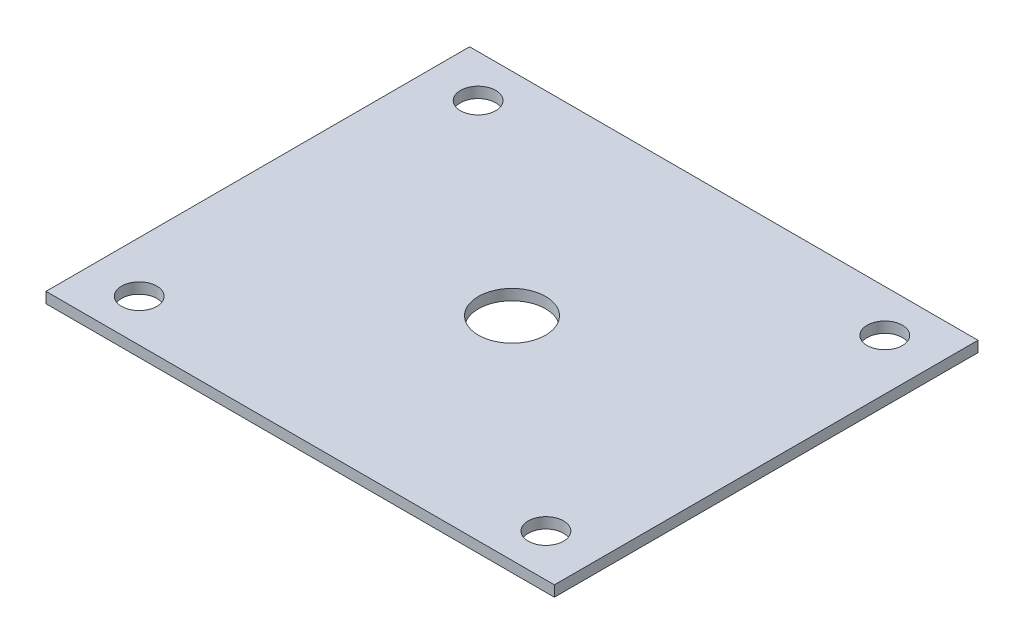
ISO-10303-21;
HEADER;
FILE_DESCRIPTION(('STEP AP214'),'2;1');
FILE_NAME('part.step','',(''),(''),'','','');
FILE_SCHEMA(('AUTOMOTIVE_DESIGN { 1 0 10303 214 1 1 1 1 }'));
ENDSEC;
DATA;
#1=APPLICATION_CONTEXT('core data for automotive mechanical design processes');
#2=APPLICATION_PROTOCOL_DEFINITION('international standard','automotive_design',2000,#1);
#3=PRODUCT_CONTEXT('',#1,'mechanical');
#4=PRODUCT('Part','Part','',(#3));
#5=PRODUCT_RELATED_PRODUCT_CATEGORY('part','',(#4));
#6=PRODUCT_DEFINITION_FORMATION('','',#4);
#7=PRODUCT_DEFINITION_CONTEXT('part definition',#1,'design');
#8=PRODUCT_DEFINITION('design','',#6,#7);
#9=PRODUCT_DEFINITION_SHAPE('','',#8);
#10=(LENGTH_UNIT() NAMED_UNIT(*) SI_UNIT(.MILLI.,.METRE.));
#11=(NAMED_UNIT(*) PLANE_ANGLE_UNIT() SI_UNIT($,.RADIAN.));
#12=(NAMED_UNIT(*) SI_UNIT($,.STERADIAN.) SOLID_ANGLE_UNIT());
#13=UNCERTAINTY_MEASURE_WITH_UNIT(LENGTH_MEASURE(1.E-05),#10,'distance_accuracy_value','');
#14=(GEOMETRIC_REPRESENTATION_CONTEXT(3) GLOBAL_UNCERTAINTY_ASSIGNED_CONTEXT((#13)) GLOBAL_UNIT_ASSIGNED_CONTEXT((#10,
#11,#12)) REPRESENTATION_CONTEXT('',''));
#15=CARTESIAN_POINT('',(0.,0.,0.));
#16=DIRECTION('',(0.,0.,1.));
#17=DIRECTION('',(1.,0.,0.));
#18=AXIS2_PLACEMENT_3D('',#15,#16,#17);
#19=CARTESIAN_POINT('',(37.5,-0.79375,31.2499999999999));
#20=DIRECTION('',(1.,0.,0.));
#21=DIRECTION('',(0.,0.,-1.));
#22=AXIS2_PLACEMENT_3D('',#19,#20,#21);
#23=PLANE('',#22);
#24=DIRECTION('',(0.,1.,0.));
#25=VECTOR('',#24,1.);
#26=CARTESIAN_POINT('',(37.5,-0.79375,-31.2500000000001));
#27=LINE('',#26,#25);
#28=CARTESIAN_POINT('',(37.5,-0.79375,-31.2500000000001));
#29=VERTEX_POINT('',#28);
#30=CARTESIAN_POINT('',(37.5,0.79375,-31.2500000000001));
#31=VERTEX_POINT('',#30);
#32=EDGE_CURVE('E36',#29,#31,#27,.T.);
#33=ORIENTED_EDGE('',*,*,#32,.T.);
#34=DIRECTION('',(0.,0.,-1.));
#35=VECTOR('',#34,1.);
#36=CARTESIAN_POINT('',(37.5,0.79375,31.2499999999999));
#37=LINE('',#36,#35);
#38=CARTESIAN_POINT('',(37.5,0.79375,31.2499999999999));
#39=VERTEX_POINT('',#38);
#40=EDGE_CURVE('E73',#39,#31,#37,.T.);
#41=ORIENTED_EDGE('',*,*,#40,.F.);
#42=DIRECTION('',(0.,1.,0.));
#43=VECTOR('',#42,1.);
#44=CARTESIAN_POINT('',(37.5,-0.79375,31.2499999999999));
#45=LINE('',#44,#43);
#46=CARTESIAN_POINT('',(37.5,-0.79375,31.2499999999999));
#47=VERTEX_POINT('',#46);
#48=EDGE_CURVE('E11',#47,#39,#45,.T.);
#49=ORIENTED_EDGE('',*,*,#48,.F.);
#50=DIRECTION('',(0.,0.,-1.));
#51=VECTOR('',#50,1.);
#52=CARTESIAN_POINT('',(37.5,-0.79375,31.2499999999999));
#53=LINE('',#52,#51);
#54=EDGE_CURVE('E74',#47,#29,#53,.T.);
#55=ORIENTED_EDGE('',*,*,#54,.T.);
#56=EDGE_LOOP('',(#33,#41,#49,#55));
#57=FACE_BOUND('',#56,.T.);
#58=ADVANCED_FACE('F33',(#57),#23,.T.);
#59=CARTESIAN_POINT('',(-37.5,-0.79375,31.2499999999999));
#60=DIRECTION('',(0.,0.,1.));
#61=DIRECTION('',(1.,0.,0.));
#62=AXIS2_PLACEMENT_3D('',#59,#60,#61);
#63=PLANE('',#62);
#64=ORIENTED_EDGE('',*,*,#48,.T.);
#65=DIRECTION('',(1.,0.,0.));
#66=VECTOR('',#65,1.);
#67=CARTESIAN_POINT('',(-37.5,0.79375,31.2499999999999));
#68=LINE('',#67,#66);
#69=CARTESIAN_POINT('',(-37.5,0.79375,31.2499999999999));
#70=VERTEX_POINT('',#69);
#71=EDGE_CURVE('E91',#70,#39,#68,.T.);
#72=ORIENTED_EDGE('',*,*,#71,.F.);
#73=DIRECTION('',(0.,1.,0.));
#74=VECTOR('',#73,1.);
#75=CARTESIAN_POINT('',(-37.5,-0.79375,31.2499999999999));
#76=LINE('',#75,#74);
#77=CARTESIAN_POINT('',(-37.5,-0.79375,31.2499999999999));
#78=VERTEX_POINT('',#77);
#79=EDGE_CURVE('E41',#78,#70,#76,.T.);
#80=ORIENTED_EDGE('',*,*,#79,.F.);
#81=DIRECTION('',(1.,0.,0.));
#82=VECTOR('',#81,1.);
#83=CARTESIAN_POINT('',(-37.5,-0.79375,31.2499999999999));
#84=LINE('',#83,#82);
#85=EDGE_CURVE('E79',#78,#47,#84,.T.);
#86=ORIENTED_EDGE('',*,*,#85,.T.);
#87=EDGE_LOOP('',(#64,#72,#80,#86));
#88=FACE_BOUND('',#87,.T.);
#89=ADVANCED_FACE('F126',(#88),#63,.T.);
#90=CARTESIAN_POINT('',(-37.5,-0.79375,31.2499999999999));
#91=DIRECTION('',(-1.,0.,0.));
#92=DIRECTION('',(0.,0.,1.));
#93=AXIS2_PLACEMENT_3D('',#90,#91,#92);
#94=PLANE('',#93);
#95=ORIENTED_EDGE('',*,*,#79,.T.);
#96=DIRECTION('',(0.,0.,1.));
#97=VECTOR('',#96,1.);
#98=CARTESIAN_POINT('',(-37.5,0.79375,31.2499999999999));
#99=LINE('',#98,#97);
#100=CARTESIAN_POINT('',(-37.5,0.79375,-31.2500000000001));
#101=VERTEX_POINT('',#100);
#102=EDGE_CURVE('E86',#101,#70,#99,.T.);
#103=ORIENTED_EDGE('',*,*,#102,.F.);
#104=DIRECTION('',(0.,1.,0.));
#105=VECTOR('',#104,1.);
#106=CARTESIAN_POINT('',(-37.5,-0.79375,-31.2500000000001));
#107=LINE('',#106,#105);
#108=CARTESIAN_POINT('',(-37.5,-0.79375,-31.2500000000001));
#109=VERTEX_POINT('',#108);
#110=EDGE_CURVE('E78',#109,#101,#107,.T.);
#111=ORIENTED_EDGE('',*,*,#110,.F.);
#112=DIRECTION('',(0.,0.,1.));
#113=VECTOR('',#112,1.);
#114=CARTESIAN_POINT('',(-37.5,-0.79375,31.2499999999999));
#115=LINE('',#114,#113);
#116=EDGE_CURVE('E119',#109,#78,#115,.T.);
#117=ORIENTED_EDGE('',*,*,#116,.T.);
#118=EDGE_LOOP('',(#95,#103,#111,#117));
#119=FACE_BOUND('',#118,.T.);
#120=ADVANCED_FACE('F123',(#119),#94,.T.);
#121=CARTESIAN_POINT('',(-37.5,-0.79375,-31.2500000000001));
#122=DIRECTION('',(0.,0.,-1.));
#123=DIRECTION('',(-1.,0.,0.));
#124=AXIS2_PLACEMENT_3D('',#121,#122,#123);
#125=PLANE('',#124);
#126=ORIENTED_EDGE('',*,*,#110,.T.);
#127=DIRECTION('',(-1.,0.,0.));
#128=VECTOR('',#127,1.);
#129=CARTESIAN_POINT('',(-37.5,0.79375,-31.2500000000001));
#130=LINE('',#129,#128);
#131=EDGE_CURVE('E81',#31,#101,#130,.T.);
#132=ORIENTED_EDGE('',*,*,#131,.F.);
#133=ORIENTED_EDGE('',*,*,#32,.F.);
#134=DIRECTION('',(-1.,0.,0.));
#135=VECTOR('',#134,1.);
#136=CARTESIAN_POINT('',(-37.5,-0.79375,-31.2500000000001));
#137=LINE('',#136,#135);
#138=EDGE_CURVE('E117',#29,#109,#137,.T.);
#139=ORIENTED_EDGE('',*,*,#138,.T.);
#140=EDGE_LOOP('',(#126,#132,#133,#139));
#141=FACE_BOUND('',#140,.T.);
#142=ADVANCED_FACE('F82',(#141),#125,.T.);
#143=CARTESIAN_POINT('',(0.,-0.79375,0.));
#144=DIRECTION('',(0.,-1.,0.));
#145=DIRECTION('',(0.,0.,-1.));
#146=AXIS2_PLACEMENT_3D('',#143,#144,#145);
#147=PLANE('',#146);
#148=CARTESIAN_POINT('',(30.,-0.79375,25.));
#149=DIRECTION('',(0.,1.,0.));
#150=DIRECTION('',(0.,0.,-1.));
#151=AXIS2_PLACEMENT_3D('',#148,#149,#150);
#152=CIRCLE('',#151,2.6);
#153=CARTESIAN_POINT('',(30.,-0.79375,22.4));
#154=VERTEX_POINT('',#153);
#155=EDGE_CURVE('E101',#154,#154,#152,.T.);
#156=ORIENTED_EDGE('',*,*,#155,.T.);
#157=EDGE_LOOP('',(#156));
#158=FACE_BOUND('',#157,.T.);
#159=CARTESIAN_POINT('',(-30.,-0.79375,25.));
#160=DIRECTION('',(0.,1.,0.));
#161=DIRECTION('',(0.,0.,1.));
#162=AXIS2_PLACEMENT_3D('',#159,#160,#161);
#163=CIRCLE('',#162,2.6);
#164=CARTESIAN_POINT('',(-30.,-0.79375,27.6));
#165=VERTEX_POINT('',#164);
#166=EDGE_CURVE('E104',#165,#165,#163,.T.);
#167=ORIENTED_EDGE('',*,*,#166,.T.);
#168=EDGE_LOOP('',(#167));
#169=FACE_BOUND('',#168,.T.);
#170=CARTESIAN_POINT('',(-30.,-0.79375,-25.));
#171=DIRECTION('',(0.,1.,0.));
#172=DIRECTION('',(0.,0.,-1.));
#173=AXIS2_PLACEMENT_3D('',#170,#171,#172);
#174=CIRCLE('',#173,2.6);
#175=CARTESIAN_POINT('',(-30.,-0.79375,-27.6));
#176=VERTEX_POINT('',#175);
#177=EDGE_CURVE('E107',#176,#176,#174,.T.);
#178=ORIENTED_EDGE('',*,*,#177,.T.);
#179=EDGE_LOOP('',(#178));
#180=FACE_BOUND('',#179,.T.);
#181=CARTESIAN_POINT('',(30.,-0.79375,-25.));
#182=DIRECTION('',(0.,1.,0.));
#183=DIRECTION('',(0.,0.,1.));
#184=AXIS2_PLACEMENT_3D('',#181,#182,#183);
#185=CIRCLE('',#184,2.6);
#186=CARTESIAN_POINT('',(30.,-0.79375,-22.4));
#187=VERTEX_POINT('',#186);
#188=EDGE_CURVE('E110',#187,#187,#185,.T.);
#189=ORIENTED_EDGE('',*,*,#188,.T.);
#190=EDGE_LOOP('',(#189));
#191=FACE_BOUND('',#190,.T.);
#192=CARTESIAN_POINT('',(-1.45423792656325E-13,-0.79375,-1.7220911745723E-13));
#193=DIRECTION('',(0.,1.,0.));
#194=DIRECTION('',(0.,0.,1.));
#195=AXIS2_PLACEMENT_3D('',#192,#193,#194);
#196=CIRCLE('',#195,4.95500000000007);
#197=CARTESIAN_POINT('',(-1.45423792656325E-13,-0.79375,4.9549999999999));
#198=VERTEX_POINT('',#197);
#199=EDGE_CURVE('E113',#198,#198,#196,.T.);
#200=ORIENTED_EDGE('',*,*,#199,.T.);
#201=EDGE_LOOP('',(#200));
#202=FACE_BOUND('',#201,.T.);
#203=ORIENTED_EDGE('',*,*,#54,.F.);
#204=ORIENTED_EDGE('',*,*,#85,.F.);
#205=ORIENTED_EDGE('',*,*,#116,.F.);
#206=ORIENTED_EDGE('',*,*,#138,.F.);
#207=EDGE_LOOP('',(#203,#204,#205,#206));
#208=FACE_BOUND('',#207,.T.);
#209=ADVANCED_FACE('F128',(#158,#169,#180,#191,#202,#208),#147,.T.);
#210=CARTESIAN_POINT('',(-1.45423792656325E-13,-0.79375,-1.7220911745723E-13));
#211=DIRECTION('',(0.,1.,0.));
#212=DIRECTION('',(0.,0.,1.));
#213=AXIS2_PLACEMENT_3D('',#210,#211,#212);
#214=CYLINDRICAL_SURFACE('',#213,4.95500000000007);
#215=ORIENTED_EDGE('',*,*,#199,.F.);
#216=EDGE_LOOP('',(#215));
#217=FACE_BOUND('',#216,.T.);
#218=CARTESIAN_POINT('',(-1.45423792656325E-13,0.79375,-1.7220911745723E-13));
#219=DIRECTION('',(0.,1.,0.));
#220=DIRECTION('',(0.,0.,1.));
#221=AXIS2_PLACEMENT_3D('',#218,#219,#220);
#222=CIRCLE('',#221,4.95500000000007);
#223=CARTESIAN_POINT('',(-1.45423792656325E-13,0.79375,4.9549999999999));
#224=VERTEX_POINT('',#223);
#225=EDGE_CURVE('E92',#224,#224,#222,.T.);
#226=ORIENTED_EDGE('',*,*,#225,.T.);
#227=EDGE_LOOP('',(#226));
#228=FACE_BOUND('',#227,.T.);
#229=ADVANCED_FACE('F130',(#217,#228),#214,.F.);
#230=CARTESIAN_POINT('',(30.,-0.79375,-25.));
#231=DIRECTION('',(0.,1.,0.));
#232=DIRECTION('',(0.,0.,1.));
#233=AXIS2_PLACEMENT_3D('',#230,#231,#232);
#234=CYLINDRICAL_SURFACE('',#233,2.6);
#235=ORIENTED_EDGE('',*,*,#188,.F.);
#236=EDGE_LOOP('',(#235));
#237=FACE_BOUND('',#236,.T.);
#238=CARTESIAN_POINT('',(30.,0.79375,-25.));
#239=DIRECTION('',(0.,1.,0.));
#240=DIRECTION('',(0.,0.,1.));
#241=AXIS2_PLACEMENT_3D('',#238,#239,#240);
#242=CIRCLE('',#241,2.6);
#243=CARTESIAN_POINT('',(30.,0.79375,-22.4));
#244=VERTEX_POINT('',#243);
#245=EDGE_CURVE('E95',#244,#244,#242,.T.);
#246=ORIENTED_EDGE('',*,*,#245,.T.);
#247=EDGE_LOOP('',(#246));
#248=FACE_BOUND('',#247,.T.);
#249=ADVANCED_FACE('F137',(#237,#248),#234,.F.);
#250=CARTESIAN_POINT('',(-30.,-0.79375,-25.));
#251=DIRECTION('',(0.,1.,0.));
#252=DIRECTION('',(0.,0.,1.));
#253=AXIS2_PLACEMENT_3D('',#250,#251,#252);
#254=CYLINDRICAL_SURFACE('',#253,2.6);
#255=ORIENTED_EDGE('',*,*,#177,.F.);
#256=EDGE_LOOP('',(#255));
#257=FACE_BOUND('',#256,.T.);
#258=CARTESIAN_POINT('',(-30.,0.79375,-25.));
#259=DIRECTION('',(0.,1.,0.));
#260=DIRECTION('',(0.,0.,-1.));
#261=AXIS2_PLACEMENT_3D('',#258,#259,#260);
#262=CIRCLE('',#261,2.6);
#263=CARTESIAN_POINT('',(-30.,0.79375,-27.6));
#264=VERTEX_POINT('',#263);
#265=EDGE_CURVE('E226',#264,#264,#262,.T.);
#266=ORIENTED_EDGE('',*,*,#265,.T.);
#267=EDGE_LOOP('',(#266));
#268=FACE_BOUND('',#267,.T.);
#269=ADVANCED_FACE('F175',(#257,#268),#254,.F.);
#270=CARTESIAN_POINT('',(-30.,-0.79375,25.));
#271=DIRECTION('',(0.,1.,0.));
#272=DIRECTION('',(0.,0.,1.));
#273=AXIS2_PLACEMENT_3D('',#270,#271,#272);
#274=CYLINDRICAL_SURFACE('',#273,2.6);
#275=ORIENTED_EDGE('',*,*,#166,.F.);
#276=EDGE_LOOP('',(#275));
#277=FACE_BOUND('',#276,.T.);
#278=CARTESIAN_POINT('',(-30.,0.79375,25.));
#279=DIRECTION('',(0.,1.,0.));
#280=DIRECTION('',(0.,0.,1.));
#281=AXIS2_PLACEMENT_3D('',#278,#279,#280);
#282=CIRCLE('',#281,2.6);
#283=CARTESIAN_POINT('',(-30.,0.79375,27.6));
#284=VERTEX_POINT('',#283);
#285=EDGE_CURVE('E223',#284,#284,#282,.T.);
#286=ORIENTED_EDGE('',*,*,#285,.T.);
#287=EDGE_LOOP('',(#286));
#288=FACE_BOUND('',#287,.T.);
#289=ADVANCED_FACE('F185',(#277,#288),#274,.F.);
#290=CARTESIAN_POINT('',(30.,-0.79375,25.));
#291=DIRECTION('',(0.,1.,0.));
#292=DIRECTION('',(0.,0.,1.));
#293=AXIS2_PLACEMENT_3D('',#290,#291,#292);
#294=CYLINDRICAL_SURFACE('',#293,2.6);
#295=ORIENTED_EDGE('',*,*,#155,.F.);
#296=EDGE_LOOP('',(#295));
#297=FACE_BOUND('',#296,.T.);
#298=CARTESIAN_POINT('',(30.,0.79375,25.));
#299=DIRECTION('',(0.,1.,0.));
#300=DIRECTION('',(0.,0.,-1.));
#301=AXIS2_PLACEMENT_3D('',#298,#299,#300);
#302=CIRCLE('',#301,2.6);
#303=CARTESIAN_POINT('',(30.,0.79375,22.4));
#304=VERTEX_POINT('',#303);
#305=EDGE_CURVE('E221',#304,#304,#302,.T.);
#306=ORIENTED_EDGE('',*,*,#305,.T.);
#307=EDGE_LOOP('',(#306));
#308=FACE_BOUND('',#307,.T.);
#309=ADVANCED_FACE('F195',(#297,#308),#294,.F.);
#310=CARTESIAN_POINT('',(0.,0.79375,0.));
#311=DIRECTION('',(0.,-1.,0.));
#312=DIRECTION('',(0.,0.,-1.));
#313=AXIS2_PLACEMENT_3D('',#310,#311,#312);
#314=PLANE('',#313);
#315=ORIENTED_EDGE('',*,*,#40,.T.);
#316=ORIENTED_EDGE('',*,*,#131,.T.);
#317=ORIENTED_EDGE('',*,*,#102,.T.);
#318=ORIENTED_EDGE('',*,*,#71,.T.);
#319=EDGE_LOOP('',(#315,#316,#317,#318));
#320=FACE_BOUND('',#319,.T.);
#321=ORIENTED_EDGE('',*,*,#225,.F.);
#322=EDGE_LOOP('',(#321));
#323=FACE_BOUND('',#322,.T.);
#324=ORIENTED_EDGE('',*,*,#245,.F.);
#325=EDGE_LOOP('',(#324));
#326=FACE_BOUND('',#325,.T.);
#327=ORIENTED_EDGE('',*,*,#265,.F.);
#328=EDGE_LOOP('',(#327));
#329=FACE_BOUND('',#328,.T.);
#330=ORIENTED_EDGE('',*,*,#285,.F.);
#331=EDGE_LOOP('',(#330));
#332=FACE_BOUND('',#331,.T.);
#333=ORIENTED_EDGE('',*,*,#305,.F.);
#334=EDGE_LOOP('',(#333));
#335=FACE_BOUND('',#334,.T.);
#336=ADVANCED_FACE('F89',(#320,#323,#326,#329,#332,#335),#314,.F.);
#337=CLOSED_SHELL('',(#58,#89,#120,#142,#209,#229,#249,#269,#289,#309,#336));
#338=MANIFOLD_SOLID_BREP('B2',#337);
#339=ADVANCED_BREP_SHAPE_REPRESENTATION('',(#18,#338),#14);
#340=SHAPE_DEFINITION_REPRESENTATION(#9,#339);
ENDSEC;
END-ISO-10303-21;
